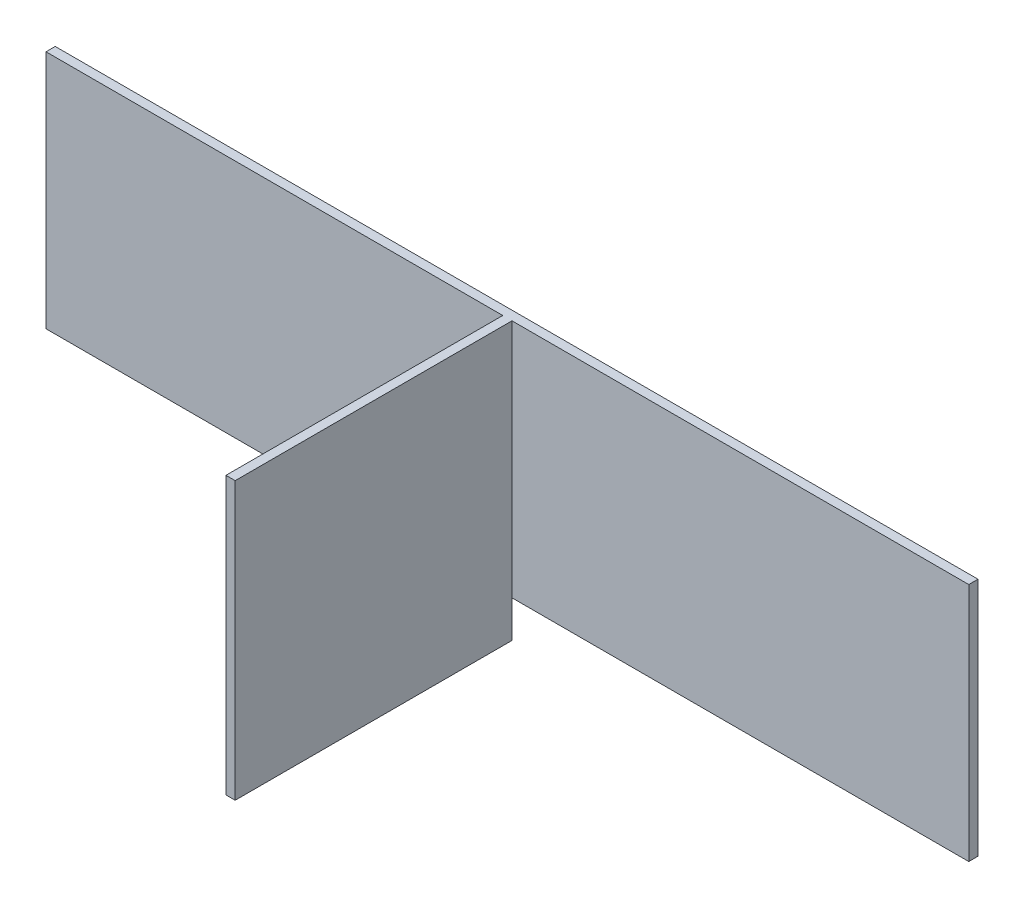
ISO-10303-21;
HEADER;
FILE_DESCRIPTION(('STEP AP214'),'2;1');
FILE_NAME('part.step','',(''),(''),'','','');
FILE_SCHEMA(('AUTOMOTIVE_DESIGN { 1 0 10303 214 1 1 1 1 }'));
ENDSEC;
DATA;
#1=APPLICATION_CONTEXT('core data for automotive mechanical design processes');
#2=APPLICATION_PROTOCOL_DEFINITION('international standard','automotive_design',2000,#1);
#3=PRODUCT_CONTEXT('',#1,'mechanical');
#4=PRODUCT('Part','Part','',(#3));
#5=PRODUCT_RELATED_PRODUCT_CATEGORY('part','',(#4));
#6=PRODUCT_DEFINITION_FORMATION('','',#4);
#7=PRODUCT_DEFINITION_CONTEXT('part definition',#1,'design');
#8=PRODUCT_DEFINITION('design','',#6,#7);
#9=PRODUCT_DEFINITION_SHAPE('','',#8);
#10=(LENGTH_UNIT() NAMED_UNIT(*) SI_UNIT(.MILLI.,.METRE.));
#11=(NAMED_UNIT(*) PLANE_ANGLE_UNIT() SI_UNIT($,.RADIAN.));
#12=(NAMED_UNIT(*) SI_UNIT($,.STERADIAN.) SOLID_ANGLE_UNIT());
#13=UNCERTAINTY_MEASURE_WITH_UNIT(LENGTH_MEASURE(1.E-05),#10,'distance_accuracy_value','');
#14=(GEOMETRIC_REPRESENTATION_CONTEXT(3) GLOBAL_UNCERTAINTY_ASSIGNED_CONTEXT((#13)) GLOBAL_UNIT_ASSIGNED_CONTEXT((#10,
#11,#12)) REPRESENTATION_CONTEXT('',''));
#15=CARTESIAN_POINT('',(0.,0.,0.));
#16=DIRECTION('',(0.,0.,1.));
#17=DIRECTION('',(1.,0.,0.));
#18=AXIS2_PLACEMENT_3D('',#15,#16,#17);
#19=CARTESIAN_POINT('',(0.,0.,5.));
#20=DIRECTION('',(0.,0.,1.));
#21=DIRECTION('',(1.,0.,0.));
#22=AXIS2_PLACEMENT_3D('',#19,#20,#21);
#23=PLANE('',#22);
#24=DIRECTION('',(0.,1.,0.));
#25=VECTOR('',#24,1.);
#26=CARTESIAN_POINT('',(2.5,-65.,5.));
#27=LINE('',#26,#25);
#28=CARTESIAN_POINT('',(2.5,-65.,5.));
#29=VERTEX_POINT('',#28);
#30=CARTESIAN_POINT('',(2.5,65.,5.));
#31=VERTEX_POINT('',#30);
#32=EDGE_CURVE('E145',#29,#31,#27,.T.);
#33=ORIENTED_EDGE('',*,*,#32,.F.);
#34=DIRECTION('',(1.,0.,0.));
#35=VECTOR('',#34,1.);
#36=CARTESIAN_POINT('',(-250.,-65.,5.));
#37=LINE('',#36,#35);
#38=CARTESIAN_POINT('',(250.,-65.,5.));
#39=VERTEX_POINT('',#38);
#40=EDGE_CURVE('E159',#29,#39,#37,.T.);
#41=ORIENTED_EDGE('',*,*,#40,.T.);
#42=DIRECTION('',(0.,1.,0.));
#43=VECTOR('',#42,1.);
#44=CARTESIAN_POINT('',(250.,-65.,5.));
#45=LINE('',#44,#43);
#46=CARTESIAN_POINT('',(250.,65.,5.));
#47=VERTEX_POINT('',#46);
#48=EDGE_CURVE('E158',#39,#47,#45,.T.);
#49=ORIENTED_EDGE('',*,*,#48,.T.);
#50=DIRECTION('',(-1.,0.,0.));
#51=VECTOR('',#50,1.);
#52=CARTESIAN_POINT('',(250.,65.,5.));
#53=LINE('',#52,#51);
#54=EDGE_CURVE('E60',#47,#31,#53,.T.);
#55=ORIENTED_EDGE('',*,*,#54,.T.);
#56=EDGE_LOOP('',(#33,#41,#49,#55));
#57=FACE_BOUND('',#56,.T.);
#58=ADVANCED_FACE('F37',(#57),#23,.T.);
#59=CARTESIAN_POINT('',(-250.,-65.,5.));
#60=DIRECTION('',(0.,1.,0.));
#61=DIRECTION('',(0.,0.,1.));
#62=AXIS2_PLACEMENT_3D('',#59,#60,#61);
#63=PLANE('',#62);
#64=ORIENTED_EDGE('',*,*,#40,.F.);
#65=DIRECTION('',(-1.,0.,0.));
#66=VECTOR('',#65,1.);
#67=CARTESIAN_POINT('',(2.5,-65.,5.));
#68=LINE('',#67,#66);
#69=CARTESIAN_POINT('',(-2.5,-65.,5.));
#70=VERTEX_POINT('',#69);
#71=EDGE_CURVE('E134',#29,#70,#68,.T.);
#72=ORIENTED_EDGE('',*,*,#71,.T.);
#73=CARTESIAN_POINT('',(-250.,-65.,5.));
#74=VERTEX_POINT('',#73);
#75=EDGE_CURVE('E156',#74,#70,#37,.T.);
#76=ORIENTED_EDGE('',*,*,#75,.F.);
#77=DIRECTION('',(0.,0.,-1.));
#78=VECTOR('',#77,1.);
#79=CARTESIAN_POINT('',(-250.,-65.,5.));
#80=LINE('',#79,#78);
#81=CARTESIAN_POINT('',(-250.,-65.,0.));
#82=VERTEX_POINT('',#81);
#83=EDGE_CURVE('E165',#74,#82,#80,.T.);
#84=ORIENTED_EDGE('',*,*,#83,.T.);
#85=DIRECTION('',(1.,0.,0.));
#86=VECTOR('',#85,1.);
#87=CARTESIAN_POINT('',(-250.,-65.,0.));
#88=LINE('',#87,#86);
#89=CARTESIAN_POINT('',(250.,-65.,0.));
#90=VERTEX_POINT('',#89);
#91=EDGE_CURVE('E155',#82,#90,#88,.T.);
#92=ORIENTED_EDGE('',*,*,#91,.T.);
#93=DIRECTION('',(0.,0.,-1.));
#94=VECTOR('',#93,1.);
#95=CARTESIAN_POINT('',(250.,-65.,5.));
#96=LINE('',#95,#94);
#97=EDGE_CURVE('E11',#39,#90,#96,.T.);
#98=ORIENTED_EDGE('',*,*,#97,.F.);
#99=EDGE_LOOP('',(#64,#72,#76,#84,#92,#98));
#100=FACE_BOUND('',#99,.T.);
#101=ADVANCED_FACE('F39',(#100),#63,.F.);
#102=CARTESIAN_POINT('',(250.,-65.,5.));
#103=DIRECTION('',(-1.,0.,0.));
#104=DIRECTION('',(0.,0.,1.));
#105=AXIS2_PLACEMENT_3D('',#102,#103,#104);
#106=PLANE('',#105);
#107=DIRECTION('',(0.,1.,0.));
#108=VECTOR('',#107,1.);
#109=CARTESIAN_POINT('',(250.,-65.,0.));
#110=LINE('',#109,#108);
#111=CARTESIAN_POINT('',(250.,65.,0.));
#112=VERTEX_POINT('',#111);
#113=EDGE_CURVE('E168',#90,#112,#110,.T.);
#114=ORIENTED_EDGE('',*,*,#113,.T.);
#115=DIRECTION('',(0.,0.,-1.));
#116=VECTOR('',#115,1.);
#117=CARTESIAN_POINT('',(250.,65.,5.));
#118=LINE('',#117,#116);
#119=EDGE_CURVE('E45',#47,#112,#118,.T.);
#120=ORIENTED_EDGE('',*,*,#119,.F.);
#121=ORIENTED_EDGE('',*,*,#48,.F.);
#122=ORIENTED_EDGE('',*,*,#97,.T.);
#123=EDGE_LOOP('',(#114,#120,#121,#122));
#124=FACE_BOUND('',#123,.T.);
#125=ADVANCED_FACE('F203',(#124),#106,.F.);
#126=CARTESIAN_POINT('',(250.,65.,5.));
#127=DIRECTION('',(0.,-1.,0.));
#128=DIRECTION('',(0.,0.,-1.));
#129=AXIS2_PLACEMENT_3D('',#126,#127,#128);
#130=PLANE('',#129);
#131=DIRECTION('',(-1.,0.,0.));
#132=VECTOR('',#131,1.);
#133=CARTESIAN_POINT('',(250.,65.,0.));
#134=LINE('',#133,#132);
#135=CARTESIAN_POINT('',(-250.,65.,0.));
#136=VERTEX_POINT('',#135);
#137=EDGE_CURVE('E170',#112,#136,#134,.T.);
#138=ORIENTED_EDGE('',*,*,#137,.T.);
#139=DIRECTION('',(0.,0.,-1.));
#140=VECTOR('',#139,1.);
#141=CARTESIAN_POINT('',(-250.,65.,5.));
#142=LINE('',#141,#140);
#143=CARTESIAN_POINT('',(-250.,65.,5.));
#144=VERTEX_POINT('',#143);
#145=EDGE_CURVE('E176',#144,#136,#142,.T.);
#146=ORIENTED_EDGE('',*,*,#145,.F.);
#147=CARTESIAN_POINT('',(-2.5,65.,5.));
#148=VERTEX_POINT('',#147);
#149=EDGE_CURVE('E161',#148,#144,#53,.T.);
#150=ORIENTED_EDGE('',*,*,#149,.F.);
#151=DIRECTION('',(0.,0.,-1.));
#152=VECTOR('',#151,1.);
#153=CARTESIAN_POINT('',(-2.5,65.,155.));
#154=LINE('',#153,#152);
#155=CARTESIAN_POINT('',(-2.5,65.,155.));
#156=VERTEX_POINT('',#155);
#157=EDGE_CURVE('E153',#156,#148,#154,.T.);
#158=ORIENTED_EDGE('',*,*,#157,.F.);
#159=DIRECTION('',(-1.,0.,0.));
#160=VECTOR('',#159,1.);
#161=CARTESIAN_POINT('',(2.5,65.,155.));
#162=LINE('',#161,#160);
#163=CARTESIAN_POINT('',(2.5,65.,155.));
#164=VERTEX_POINT('',#163);
#165=EDGE_CURVE('E115',#164,#156,#162,.T.);
#166=ORIENTED_EDGE('',*,*,#165,.F.);
#167=DIRECTION('',(0.,0.,-1.));
#168=VECTOR('',#167,1.);
#169=CARTESIAN_POINT('',(2.5,65.,155.));
#170=LINE('',#169,#168);
#171=EDGE_CURVE('E148',#164,#31,#170,.T.);
#172=ORIENTED_EDGE('',*,*,#171,.T.);
#173=ORIENTED_EDGE('',*,*,#54,.F.);
#174=ORIENTED_EDGE('',*,*,#119,.T.);
#175=EDGE_LOOP('',(#138,#146,#150,#158,#166,#172,#173,#174));
#176=FACE_BOUND('',#175,.T.);
#177=ADVANCED_FACE('F182',(#176),#130,.F.);
#178=CARTESIAN_POINT('',(-250.,65.,5.));
#179=DIRECTION('',(1.,0.,0.));
#180=DIRECTION('',(0.,0.,-1.));
#181=AXIS2_PLACEMENT_3D('',#178,#179,#180);
#182=PLANE('',#181);
#183=DIRECTION('',(0.,-1.,0.));
#184=VECTOR('',#183,1.);
#185=CARTESIAN_POINT('',(-250.,65.,0.));
#186=LINE('',#185,#184);
#187=EDGE_CURVE('E172',#136,#82,#186,.T.);
#188=ORIENTED_EDGE('',*,*,#187,.T.);
#189=ORIENTED_EDGE('',*,*,#83,.F.);
#190=DIRECTION('',(0.,-1.,0.));
#191=VECTOR('',#190,1.);
#192=CARTESIAN_POINT('',(-250.,65.,5.));
#193=LINE('',#192,#191);
#194=EDGE_CURVE('E163',#144,#74,#193,.T.);
#195=ORIENTED_EDGE('',*,*,#194,.F.);
#196=ORIENTED_EDGE('',*,*,#145,.T.);
#197=EDGE_LOOP('',(#188,#189,#195,#196));
#198=FACE_BOUND('',#197,.T.);
#199=ADVANCED_FACE('F192',(#198),#182,.F.);
#200=DIRECTION('',(0.,-1.,0.));
#201=VECTOR('',#200,1.);
#202=CARTESIAN_POINT('',(-2.5,65.,5.));
#203=LINE('',#202,#201);
#204=EDGE_CURVE('E52',#148,#70,#203,.T.);
#205=ORIENTED_EDGE('',*,*,#204,.F.);
#206=ORIENTED_EDGE('',*,*,#149,.T.);
#207=ORIENTED_EDGE('',*,*,#194,.T.);
#208=ORIENTED_EDGE('',*,*,#75,.T.);
#209=EDGE_LOOP('',(#205,#206,#207,#208));
#210=FACE_BOUND('',#209,.T.);
#211=ADVANCED_FACE('F199',(#210),#23,.T.);
#212=CARTESIAN_POINT('',(0.,0.,0.));
#213=DIRECTION('',(0.,0.,1.));
#214=DIRECTION('',(1.,0.,0.));
#215=AXIS2_PLACEMENT_3D('',#212,#213,#214);
#216=PLANE('',#215);
#217=ORIENTED_EDGE('',*,*,#91,.F.);
#218=ORIENTED_EDGE('',*,*,#187,.F.);
#219=ORIENTED_EDGE('',*,*,#137,.F.);
#220=ORIENTED_EDGE('',*,*,#113,.F.);
#221=EDGE_LOOP('',(#217,#218,#219,#220));
#222=FACE_BOUND('',#221,.T.);
#223=ADVANCED_FACE('F189',(#222),#216,.F.);
#224=CARTESIAN_POINT('',(-2.5,65.,155.));
#225=DIRECTION('',(1.,0.,0.));
#226=DIRECTION('',(0.,1.,0.));
#227=AXIS2_PLACEMENT_3D('',#224,#225,#226);
#228=PLANE('',#227);
#229=ORIENTED_EDGE('',*,*,#204,.T.);
#230=DIRECTION('',(0.,1.,0.));
#231=VECTOR('',#230,1.);
#232=CARTESIAN_POINT('',(-2.5,-85.,5.));
#233=LINE('',#232,#231);
#234=CARTESIAN_POINT('',(-2.5,-85.,5.));
#235=VERTEX_POINT('',#234);
#236=EDGE_CURVE('E133',#235,#70,#233,.T.);
#237=ORIENTED_EDGE('',*,*,#236,.F.);
#238=DIRECTION('',(0.,0.,1.));
#239=VECTOR('',#238,1.);
#240=CARTESIAN_POINT('',(-2.5,-85.,5.));
#241=LINE('',#240,#239);
#242=CARTESIAN_POINT('',(-2.5,-85.,155.));
#243=VERTEX_POINT('',#242);
#244=EDGE_CURVE('E127',#235,#243,#241,.T.);
#245=ORIENTED_EDGE('',*,*,#244,.T.);
#246=DIRECTION('',(0.,-1.,0.));
#247=VECTOR('',#246,1.);
#248=CARTESIAN_POINT('',(-2.5,65.,155.));
#249=LINE('',#248,#247);
#250=EDGE_CURVE('E110',#156,#243,#249,.T.);
#251=ORIENTED_EDGE('',*,*,#250,.F.);
#252=ORIENTED_EDGE('',*,*,#157,.T.);
#253=EDGE_LOOP('',(#229,#237,#245,#251,#252));
#254=FACE_BOUND('',#253,.T.);
#255=ADVANCED_FACE('F132',(#254),#228,.F.);
#256=CARTESIAN_POINT('',(2.5,-65.,155.));
#257=DIRECTION('',(-1.,0.,0.));
#258=DIRECTION('',(0.,-1.,0.));
#259=AXIS2_PLACEMENT_3D('',#256,#257,#258);
#260=PLANE('',#259);
#261=ORIENTED_EDGE('',*,*,#32,.T.);
#262=ORIENTED_EDGE('',*,*,#171,.F.);
#263=DIRECTION('',(0.,1.,0.));
#264=VECTOR('',#263,1.);
#265=CARTESIAN_POINT('',(2.5,-65.,155.));
#266=LINE('',#265,#264);
#267=CARTESIAN_POINT('',(2.5,-85.,155.));
#268=VERTEX_POINT('',#267);
#269=EDGE_CURVE('E120',#268,#164,#266,.T.);
#270=ORIENTED_EDGE('',*,*,#269,.F.);
#271=DIRECTION('',(0.,0.,-1.));
#272=VECTOR('',#271,1.);
#273=CARTESIAN_POINT('',(2.5,-85.,155.));
#274=LINE('',#273,#272);
#275=CARTESIAN_POINT('',(2.5,-85.,5.));
#276=VERTEX_POINT('',#275);
#277=EDGE_CURVE('E130',#268,#276,#274,.T.);
#278=ORIENTED_EDGE('',*,*,#277,.T.);
#279=DIRECTION('',(0.,1.,0.));
#280=VECTOR('',#279,1.);
#281=CARTESIAN_POINT('',(2.5,-85.,5.));
#282=LINE('',#281,#280);
#283=EDGE_CURVE('E141',#276,#29,#282,.T.);
#284=ORIENTED_EDGE('',*,*,#283,.T.);
#285=EDGE_LOOP('',(#261,#262,#270,#278,#284));
#286=FACE_BOUND('',#285,.T.);
#287=ADVANCED_FACE('F202',(#286),#260,.F.);
#288=CARTESIAN_POINT('',(0.,0.,155.));
#289=DIRECTION('',(0.,0.,1.));
#290=DIRECTION('',(1.,0.,0.));
#291=AXIS2_PLACEMENT_3D('',#288,#289,#290);
#292=PLANE('',#291);
#293=ORIENTED_EDGE('',*,*,#165,.T.);
#294=ORIENTED_EDGE('',*,*,#250,.T.);
#295=DIRECTION('',(1.,0.,0.));
#296=VECTOR('',#295,1.);
#297=CARTESIAN_POINT('',(-2.5,-85.,155.));
#298=LINE('',#297,#296);
#299=EDGE_CURVE('E113',#243,#268,#298,.T.);
#300=ORIENTED_EDGE('',*,*,#299,.T.);
#301=ORIENTED_EDGE('',*,*,#269,.T.);
#302=EDGE_LOOP('',(#293,#294,#300,#301));
#303=FACE_BOUND('',#302,.T.);
#304=ADVANCED_FACE('F112',(#303),#292,.T.);
#305=CARTESIAN_POINT('',(2.5,-85.,5.));
#306=DIRECTION('',(0.,0.,-1.));
#307=DIRECTION('',(-1.,0.,0.));
#308=AXIS2_PLACEMENT_3D('',#305,#306,#307);
#309=PLANE('',#308);
#310=ORIENTED_EDGE('',*,*,#71,.F.);
#311=ORIENTED_EDGE('',*,*,#283,.F.);
#312=DIRECTION('',(-1.,0.,0.));
#313=VECTOR('',#312,1.);
#314=CARTESIAN_POINT('',(2.5,-85.,5.));
#315=LINE('',#314,#313);
#316=EDGE_CURVE('E140',#276,#235,#315,.T.);
#317=ORIENTED_EDGE('',*,*,#316,.T.);
#318=ORIENTED_EDGE('',*,*,#236,.T.);
#319=EDGE_LOOP('',(#310,#311,#317,#318));
#320=FACE_BOUND('',#319,.T.);
#321=ADVANCED_FACE('F277',(#320),#309,.T.);
#322=CARTESIAN_POINT('',(0.,-85.,0.));
#323=DIRECTION('',(0.,1.,0.));
#324=DIRECTION('',(0.,0.,1.));
#325=AXIS2_PLACEMENT_3D('',#322,#323,#324);
#326=PLANE('',#325);
#327=ORIENTED_EDGE('',*,*,#244,.F.);
#328=ORIENTED_EDGE('',*,*,#316,.F.);
#329=ORIENTED_EDGE('',*,*,#277,.F.);
#330=ORIENTED_EDGE('',*,*,#299,.F.);
#331=EDGE_LOOP('',(#327,#328,#329,#330));
#332=FACE_BOUND('',#331,.T.);
#333=ADVANCED_FACE('F125',(#332),#326,.F.);
#334=CLOSED_SHELL('',(#58,#101,#125,#177,#199,#211,#223,#255,#287,#304,#321,#333));
#335=MANIFOLD_SOLID_BREP('B2',#334);
#336=ADVANCED_BREP_SHAPE_REPRESENTATION('',(#18,#335),#14);
#337=SHAPE_DEFINITION_REPRESENTATION(#9,#336);
ENDSEC;
END-ISO-10303-21;
